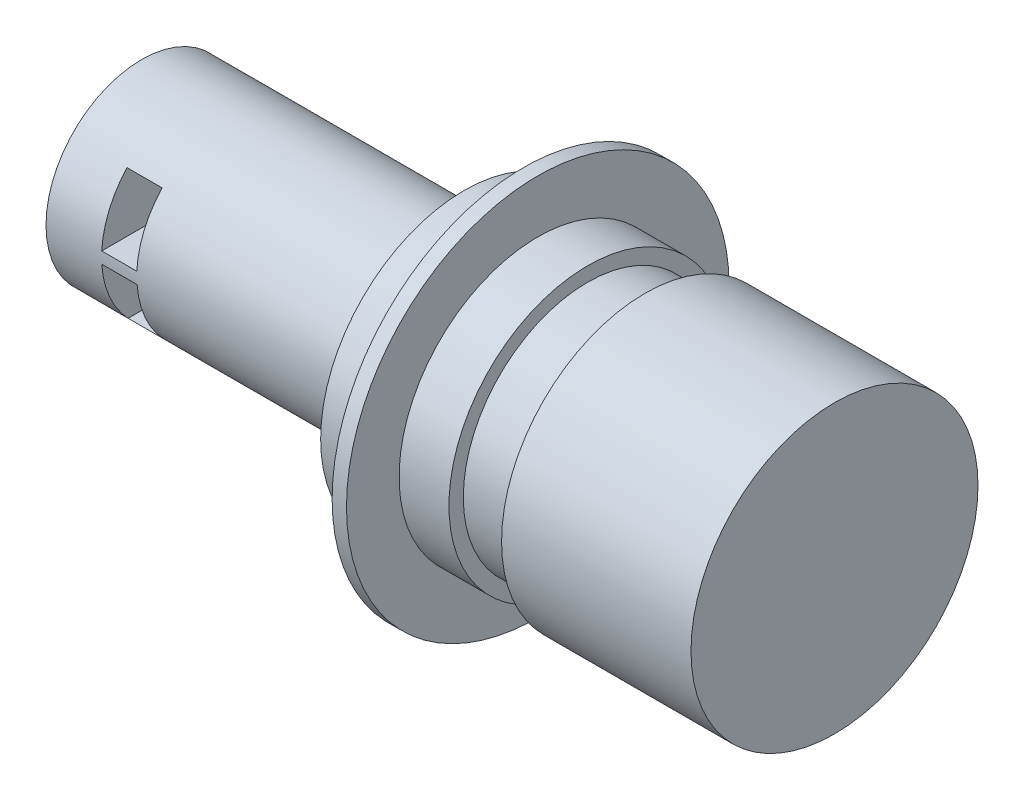
ISO-10303-21;
HEADER;
FILE_DESCRIPTION(('STEP AP214'),'2;1');
FILE_NAME('part.step','',(''),(''),'','','');
FILE_SCHEMA(('AUTOMOTIVE_DESIGN { 1 0 10303 214 1 1 1 1 }'));
ENDSEC;
DATA;
#1=APPLICATION_CONTEXT('core data for automotive mechanical design processes');
#2=APPLICATION_PROTOCOL_DEFINITION('international standard','automotive_design',2000,#1);
#3=PRODUCT_CONTEXT('',#1,'mechanical');
#4=PRODUCT('Part','Part','',(#3));
#5=PRODUCT_RELATED_PRODUCT_CATEGORY('part','',(#4));
#6=PRODUCT_DEFINITION_FORMATION('','',#4);
#7=PRODUCT_DEFINITION_CONTEXT('part definition',#1,'design');
#8=PRODUCT_DEFINITION('design','',#6,#7);
#9=PRODUCT_DEFINITION_SHAPE('','',#8);
#10=(LENGTH_UNIT() NAMED_UNIT(*) SI_UNIT(.MILLI.,.METRE.));
#11=(NAMED_UNIT(*) PLANE_ANGLE_UNIT() SI_UNIT($,.RADIAN.));
#12=(NAMED_UNIT(*) SI_UNIT($,.STERADIAN.) SOLID_ANGLE_UNIT());
#13=UNCERTAINTY_MEASURE_WITH_UNIT(LENGTH_MEASURE(1.E-05),#10,'distance_accuracy_value','');
#14=(GEOMETRIC_REPRESENTATION_CONTEXT(3) GLOBAL_UNCERTAINTY_ASSIGNED_CONTEXT((#13)) GLOBAL_UNIT_ASSIGNED_CONTEXT((#10,
#11,#12)) REPRESENTATION_CONTEXT('',''));
#15=CARTESIAN_POINT('',(0.,0.,0.));
#16=DIRECTION('',(0.,0.,1.));
#17=DIRECTION('',(1.,0.,0.));
#18=AXIS2_PLACEMENT_3D('',#15,#16,#17);
#19=CARTESIAN_POINT('',(-3.50679611650485,30.5473050734273,0.));
#20=DIRECTION('',(1.,0.,0.));
#21=DIRECTION('',(0.,0.,-1.));
#22=AXIS2_PLACEMENT_3D('',#19,#20,#21);
#23=CYLINDRICAL_SURFACE('',#22,10.);
#24=CARTESIAN_POINT('',(2.30239127901001,30.5473050734273,0.));
#25=DIRECTION('',(-1.,0.,0.));
#26=DIRECTION('',(0.,-1.,0.));
#27=AXIS2_PLACEMENT_3D('',#24,#25,#26);
#28=CIRCLE('',#27,10.);
#29=CARTESIAN_POINT('',(2.30239127901001,23.6377288354249,-7.22895263584102));
#30=VERTEX_POINT('',#29);
#31=CARTESIAN_POINT('',(2.30239127901001,29.9138536312668,-9.97991679676864));
#32=VERTEX_POINT('',#31);
#33=EDGE_CURVE('E11',#30,#32,#28,.F.);
#34=ORIENTED_EDGE('',*,*,#33,.F.);
#35=DIRECTION('',(1.,0.,0.));
#36=VECTOR('',#35,1.);
#37=CARTESIAN_POINT('',(-3.50679611650485,23.6377288354249,-7.22895263584102));
#38=LINE('',#37,#36);
#39=CARTESIAN_POINT('',(6.00266542996301,23.6377288354249,-7.22895263584102));
#40=VERTEX_POINT('',#39);
#41=EDGE_CURVE('E79',#40,#30,#38,.F.);
#42=ORIENTED_EDGE('',*,*,#41,.F.);
#43=CARTESIAN_POINT('',(6.00266542996301,30.5473050734273,0.));
#44=DIRECTION('',(-1.,0.,0.));
#45=DIRECTION('',(0.,-1.,0.));
#46=AXIS2_PLACEMENT_3D('',#43,#44,#45);
#47=CIRCLE('',#46,10.);
#48=CARTESIAN_POINT('',(6.00266542996301,29.9138536312668,-9.97991679676865));
#49=VERTEX_POINT('',#48);
#50=EDGE_CURVE('E85',#40,#49,#47,.F.);
#51=ORIENTED_EDGE('',*,*,#50,.T.);
#52=DIRECTION('',(1.,0.,0.));
#53=VECTOR('',#52,1.);
#54=CARTESIAN_POINT('',(-3.50679611650485,29.9138536312668,-9.97991679676864));
#55=LINE('',#54,#53);
#56=EDGE_CURVE('E19',#49,#32,#55,.F.);
#57=ORIENTED_EDGE('',*,*,#56,.T.);
#58=EDGE_LOOP('',(#34,#42,#51,#57));
#59=FACE_BOUND('',#58,.T.);
#60=CARTESIAN_POINT('',(2.30239127901001,29.9138536312668,9.97991679676864));
#61=VERTEX_POINT('',#60);
#62=CARTESIAN_POINT('',(2.30239127901001,23.6377288354249,7.22895263584102));
#63=VERTEX_POINT('',#62);
#64=EDGE_CURVE('E26',#61,#63,#28,.F.);
#65=ORIENTED_EDGE('',*,*,#64,.F.);
#66=DIRECTION('',(1.,0.,0.));
#67=VECTOR('',#66,1.);
#68=CARTESIAN_POINT('',(-3.50679611650485,29.9138536312668,9.97991679676864));
#69=LINE('',#68,#67);
#70=CARTESIAN_POINT('',(6.00266542996301,29.9138536312668,9.97991679676864));
#71=VERTEX_POINT('',#70);
#72=EDGE_CURVE('E109',#61,#71,#69,.T.);
#73=ORIENTED_EDGE('',*,*,#72,.T.);
#74=CARTESIAN_POINT('',(6.00266542996301,23.6377288354249,7.22895263584102));
#75=VERTEX_POINT('',#74);
#76=EDGE_CURVE('E104',#71,#75,#47,.F.);
#77=ORIENTED_EDGE('',*,*,#76,.T.);
#78=DIRECTION('',(1.,0.,0.));
#79=VECTOR('',#78,1.);
#80=CARTESIAN_POINT('',(-3.50679611650485,23.6377288354249,7.22895263584102));
#81=LINE('',#80,#79);
#82=EDGE_CURVE('E110',#63,#75,#81,.T.);
#83=ORIENTED_EDGE('',*,*,#82,.F.);
#84=EDGE_LOOP('',(#65,#73,#77,#83));
#85=FACE_BOUND('',#84,.T.);
#86=CARTESIAN_POINT('',(2.30239127901001,30.5473050734273,0.));
#87=DIRECTION('',(-1.,0.,0.));
#88=DIRECTION('',(0.,0.,1.));
#89=AXIS2_PLACEMENT_3D('',#86,#87,#88);
#90=CIRCLE('',#89,10.);
#91=CARTESIAN_POINT('',(2.30239127901001,31.1139114812485,-9.98393495464669));
#92=VERTEX_POINT('',#91);
#93=CARTESIAN_POINT('',(2.30239127901001,37.3368407984636,-7.3418120813908));
#94=VERTEX_POINT('',#93);
#95=EDGE_CURVE('E114',#92,#94,#90,.F.);
#96=ORIENTED_EDGE('',*,*,#95,.F.);
#97=DIRECTION('',(1.,0.,0.));
#98=VECTOR('',#97,1.);
#99=CARTESIAN_POINT('',(-3.50679611650485,31.1139114812485,-9.98393495464669));
#100=LINE('',#99,#98);
#101=CARTESIAN_POINT('',(5.96455764710562,31.1139114812485,-9.98393495464669));
#102=VERTEX_POINT('',#101);
#103=EDGE_CURVE('E124',#102,#92,#100,.F.);
#104=ORIENTED_EDGE('',*,*,#103,.F.);
#105=CARTESIAN_POINT('',(5.96455764710562,30.5473050734273,0.));
#106=DIRECTION('',(-1.,0.,0.));
#107=DIRECTION('',(0.,0.,1.));
#108=AXIS2_PLACEMENT_3D('',#105,#106,#107);
#109=CIRCLE('',#108,10.);
#110=CARTESIAN_POINT('',(5.96455764710562,37.3368407984636,-7.3418120813908));
#111=VERTEX_POINT('',#110);
#112=EDGE_CURVE('E123',#102,#111,#109,.F.);
#113=ORIENTED_EDGE('',*,*,#112,.T.);
#114=DIRECTION('',(1.,0.,0.));
#115=VECTOR('',#114,1.);
#116=CARTESIAN_POINT('',(-3.50679611650485,37.3368407984636,-7.3418120813908));
#117=LINE('',#116,#115);
#118=EDGE_CURVE('E116',#111,#94,#117,.F.);
#119=ORIENTED_EDGE('',*,*,#118,.T.);
#120=EDGE_LOOP('',(#96,#104,#113,#119));
#121=FACE_BOUND('',#120,.T.);
#122=CARTESIAN_POINT('',(2.30239127901001,37.3368407984636,7.3418120813908));
#123=VERTEX_POINT('',#122);
#124=CARTESIAN_POINT('',(2.30239127901001,31.1139114812485,9.98393495464669));
#125=VERTEX_POINT('',#124);
#126=EDGE_CURVE('E118',#123,#125,#90,.F.);
#127=ORIENTED_EDGE('',*,*,#126,.F.);
#128=DIRECTION('',(1.,0.,0.));
#129=VECTOR('',#128,1.);
#130=CARTESIAN_POINT('',(-3.50679611650485,37.3368407984636,7.3418120813908));
#131=LINE('',#130,#129);
#132=CARTESIAN_POINT('',(5.96455764710562,37.3368407984636,7.3418120813908));
#133=VERTEX_POINT('',#132);
#134=EDGE_CURVE('E129',#123,#133,#131,.T.);
#135=ORIENTED_EDGE('',*,*,#134,.T.);
#136=CARTESIAN_POINT('',(5.96455764710562,31.1139114812485,9.98393495464669));
#137=VERTEX_POINT('',#136);
#138=EDGE_CURVE('E133',#133,#137,#109,.F.);
#139=ORIENTED_EDGE('',*,*,#138,.T.);
#140=DIRECTION('',(1.,0.,0.));
#141=VECTOR('',#140,1.);
#142=CARTESIAN_POINT('',(-3.50679611650485,31.1139114812485,9.98393495464669));
#143=LINE('',#142,#141);
#144=EDGE_CURVE('E137',#125,#137,#143,.T.);
#145=ORIENTED_EDGE('',*,*,#144,.F.);
#146=EDGE_LOOP('',(#127,#135,#139,#145));
#147=FACE_BOUND('',#146,.T.);
#148=CARTESIAN_POINT('',(-3.50679611650485,30.5473050734273,0.));
#149=DIRECTION('',(1.,0.,0.));
#150=DIRECTION('',(0.,0.,-1.));
#151=AXIS2_PLACEMENT_3D('',#148,#149,#150);
#152=CIRCLE('',#151,10.);
#153=CARTESIAN_POINT('',(-3.50679611650485,30.5473050734273,-10.));
#154=VERTEX_POINT('',#153);
#155=EDGE_CURVE('E140',#154,#154,#152,.T.);
#156=ORIENTED_EDGE('',*,*,#155,.T.);
#157=EDGE_LOOP('',(#156));
#158=FACE_BOUND('',#157,.T.);
#159=CARTESIAN_POINT('',(30.2,30.5473050734273,0.));
#160=DIRECTION('',(1.,0.,0.));
#161=DIRECTION('',(0.,0.,-1.));
#162=AXIS2_PLACEMENT_3D('',#159,#160,#161);
#163=CIRCLE('',#162,10.);
#164=CARTESIAN_POINT('',(30.2,30.5473050734273,-10.));
#165=VERTEX_POINT('',#164);
#166=EDGE_CURVE('E144',#165,#165,#163,.T.);
#167=ORIENTED_EDGE('',*,*,#166,.F.);
#168=EDGE_LOOP('',(#167));
#169=FACE_BOUND('',#168,.T.);
#170=ADVANCED_FACE('F16',(#59,#85,#121,#147,#158,#169),#23,.T.);
#171=CARTESIAN_POINT('',(-3.50679611650485,30.5473050734273,0.));
#172=DIRECTION('',(1.,0.,0.));
#173=DIRECTION('',(0.,0.,-1.));
#174=AXIS2_PLACEMENT_3D('',#171,#172,#173);
#175=PLANE('',#174);
#176=ORIENTED_EDGE('',*,*,#155,.F.);
#177=EDGE_LOOP('',(#176));
#178=FACE_BOUND('',#177,.T.);
#179=ADVANCED_FACE('F229',(#178),#175,.F.);
#180=CARTESIAN_POINT('',(36.4,30.5473050734273,0.));
#181=DIRECTION('',(-1.,0.,0.));
#182=DIRECTION('',(0.,0.,1.));
#183=AXIS2_PLACEMENT_3D('',#180,#181,#182);
#184=CYLINDRICAL_SURFACE('',#183,15.);
#185=CARTESIAN_POINT('',(36.4,30.5473050734273,0.));
#186=DIRECTION('',(1.,0.,0.));
#187=DIRECTION('',(0.,0.,-1.));
#188=AXIS2_PLACEMENT_3D('',#185,#186,#187);
#189=CIRCLE('',#188,15.);
#190=CARTESIAN_POINT('',(36.4,30.5473050734273,-15.));
#191=VERTEX_POINT('',#190);
#192=EDGE_CURVE('E148',#191,#191,#189,.T.);
#193=ORIENTED_EDGE('',*,*,#192,.F.);
#194=EDGE_LOOP('',(#193));
#195=FACE_BOUND('',#194,.T.);
#196=CARTESIAN_POINT('',(30.2,30.5473050734273,0.));
#197=DIRECTION('',(1.,0.,0.));
#198=DIRECTION('',(0.,0.,-1.));
#199=AXIS2_PLACEMENT_3D('',#196,#197,#198);
#200=CIRCLE('',#199,15.);
#201=CARTESIAN_POINT('',(30.2,30.5473050734273,-15.));
#202=VERTEX_POINT('',#201);
#203=EDGE_CURVE('E149',#202,#202,#200,.T.);
#204=ORIENTED_EDGE('',*,*,#203,.T.);
#205=EDGE_LOOP('',(#204));
#206=FACE_BOUND('',#205,.T.);
#207=ADVANCED_FACE('F232',(#195,#206),#184,.T.);
#208=CARTESIAN_POINT('',(30.2,30.5473050734273,0.));
#209=DIRECTION('',(1.,0.,0.));
#210=DIRECTION('',(0.,0.,-1.));
#211=AXIS2_PLACEMENT_3D('',#208,#209,#210);
#212=PLANE('',#211);
#213=ORIENTED_EDGE('',*,*,#166,.T.);
#214=EDGE_LOOP('',(#213));
#215=FACE_BOUND('',#214,.T.);
#216=ORIENTED_EDGE('',*,*,#203,.F.);
#217=EDGE_LOOP('',(#216));
#218=FACE_BOUND('',#217,.T.);
#219=ADVANCED_FACE('F236',(#215,#218),#212,.F.);
#220=CARTESIAN_POINT('',(2.30239127901001,37.3368407984636,-11.));
#221=DIRECTION('',(-1.,0.,0.));
#222=DIRECTION('',(0.,0.,1.));
#223=AXIS2_PLACEMENT_3D('',#220,#221,#222);
#224=PLANE('',#223);
#225=ORIENTED_EDGE('',*,*,#95,.T.);
#226=DIRECTION('',(0.,0.,1.));
#227=VECTOR('',#226,1.);
#228=CARTESIAN_POINT('',(2.30239127901001,37.3368407984636,-11.));
#229=LINE('',#228,#227);
#230=EDGE_CURVE('E153',#94,#123,#229,.T.);
#231=ORIENTED_EDGE('',*,*,#230,.T.);
#232=ORIENTED_EDGE('',*,*,#126,.T.);
#233=DIRECTION('',(0.,0.,1.));
#234=VECTOR('',#233,1.);
#235=CARTESIAN_POINT('',(2.30239127901001,31.1139114812485,-11.));
#236=LINE('',#235,#234);
#237=EDGE_CURVE('E157',#92,#125,#236,.T.);
#238=ORIENTED_EDGE('',*,*,#237,.F.);
#239=EDGE_LOOP('',(#225,#231,#232,#238));
#240=FACE_BOUND('',#239,.T.);
#241=ADVANCED_FACE('F243',(#240),#224,.F.);
#242=CARTESIAN_POINT('',(2.30239127901001,37.3368407984636,-11.));
#243=DIRECTION('',(0.,-1.,0.));
#244=DIRECTION('',(0.,0.,-1.));
#245=AXIS2_PLACEMENT_3D('',#242,#243,#244);
#246=PLANE('',#245);
#247=DIRECTION('',(0.,0.,1.));
#248=VECTOR('',#247,1.);
#249=CARTESIAN_POINT('',(5.96455764710562,37.3368407984636,-11.));
#250=LINE('',#249,#248);
#251=EDGE_CURVE('E165',#111,#133,#250,.T.);
#252=ORIENTED_EDGE('',*,*,#251,.T.);
#253=ORIENTED_EDGE('',*,*,#134,.F.);
#254=ORIENTED_EDGE('',*,*,#230,.F.);
#255=ORIENTED_EDGE('',*,*,#118,.F.);
#256=EDGE_LOOP('',(#252,#253,#254,#255));
#257=FACE_BOUND('',#256,.T.);
#258=ADVANCED_FACE('F247',(#257),#246,.T.);
#259=CARTESIAN_POINT('',(5.96455764710562,37.3368407984636,-11.));
#260=DIRECTION('',(-1.,0.,0.));
#261=DIRECTION('',(0.,0.,1.));
#262=AXIS2_PLACEMENT_3D('',#259,#260,#261);
#263=PLANE('',#262);
#264=DIRECTION('',(0.,0.,1.));
#265=VECTOR('',#264,1.);
#266=CARTESIAN_POINT('',(5.96455764710562,31.1139114812485,-11.));
#267=LINE('',#266,#265);
#268=EDGE_CURVE('E160',#102,#137,#267,.T.);
#269=ORIENTED_EDGE('',*,*,#268,.T.);
#270=ORIENTED_EDGE('',*,*,#138,.F.);
#271=ORIENTED_EDGE('',*,*,#251,.F.);
#272=ORIENTED_EDGE('',*,*,#112,.F.);
#273=EDGE_LOOP('',(#269,#270,#271,#272));
#274=FACE_BOUND('',#273,.T.);
#275=ADVANCED_FACE('F252',(#274),#263,.T.);
#276=CARTESIAN_POINT('',(2.30239127901001,31.1139114812485,-11.));
#277=DIRECTION('',(0.,-1.,0.));
#278=DIRECTION('',(0.,0.,-1.));
#279=AXIS2_PLACEMENT_3D('',#276,#277,#278);
#280=PLANE('',#279);
#281=ORIENTED_EDGE('',*,*,#103,.T.);
#282=ORIENTED_EDGE('',*,*,#237,.T.);
#283=ORIENTED_EDGE('',*,*,#144,.T.);
#284=ORIENTED_EDGE('',*,*,#268,.F.);
#285=EDGE_LOOP('',(#281,#282,#283,#284));
#286=FACE_BOUND('',#285,.T.);
#287=ADVANCED_FACE('F249',(#286),#280,.F.);
#288=CARTESIAN_POINT('',(2.30239127901001,29.9138536312668,-10.75));
#289=DIRECTION('',(-1.,0.,0.));
#290=DIRECTION('',(0.,-1.,0.));
#291=AXIS2_PLACEMENT_3D('',#288,#289,#290);
#292=PLANE('',#291);
#293=ORIENTED_EDGE('',*,*,#33,.T.);
#294=DIRECTION('',(0.,0.,1.));
#295=VECTOR('',#294,1.);
#296=CARTESIAN_POINT('',(2.30239127901001,29.9138536312668,-10.75));
#297=LINE('',#296,#295);
#298=EDGE_CURVE('E161',#32,#61,#297,.T.);
#299=ORIENTED_EDGE('',*,*,#298,.T.);
#300=ORIENTED_EDGE('',*,*,#64,.T.);
#301=DIRECTION('',(0.,0.,1.));
#302=VECTOR('',#301,1.);
#303=CARTESIAN_POINT('',(2.30239127901001,23.6377288354249,-10.75));
#304=LINE('',#303,#302);
#305=EDGE_CURVE('E38',#30,#63,#304,.T.);
#306=ORIENTED_EDGE('',*,*,#305,.F.);
#307=EDGE_LOOP('',(#293,#299,#300,#306));
#308=FACE_BOUND('',#307,.T.);
#309=ADVANCED_FACE('F87',(#308),#292,.F.);
#310=CARTESIAN_POINT('',(2.30239127901001,29.9138536312668,-10.75));
#311=DIRECTION('',(0.,-1.,0.));
#312=DIRECTION('',(0.,0.,-1.));
#313=AXIS2_PLACEMENT_3D('',#310,#311,#312);
#314=PLANE('',#313);
#315=DIRECTION('',(0.,0.,1.));
#316=VECTOR('',#315,1.);
#317=CARTESIAN_POINT('',(6.00266542996301,29.9138536312668,-10.75));
#318=LINE('',#317,#316);
#319=EDGE_CURVE('E174',#49,#71,#318,.T.);
#320=ORIENTED_EDGE('',*,*,#319,.T.);
#321=ORIENTED_EDGE('',*,*,#72,.F.);
#322=ORIENTED_EDGE('',*,*,#298,.F.);
#323=ORIENTED_EDGE('',*,*,#56,.F.);
#324=EDGE_LOOP('',(#320,#321,#322,#323));
#325=FACE_BOUND('',#324,.T.);
#326=ADVANCED_FACE('F262',(#325),#314,.T.);
#327=CARTESIAN_POINT('',(6.00266542996301,29.9138536312668,-10.75));
#328=DIRECTION('',(-1.,0.,0.));
#329=DIRECTION('',(0.,-1.,0.));
#330=AXIS2_PLACEMENT_3D('',#327,#328,#329);
#331=PLANE('',#330);
#332=DIRECTION('',(0.,0.,1.));
#333=VECTOR('',#332,1.);
#334=CARTESIAN_POINT('',(6.00266542996301,23.6377288354249,-10.75));
#335=LINE('',#334,#333);
#336=EDGE_CURVE('E33',#40,#75,#335,.T.);
#337=ORIENTED_EDGE('',*,*,#336,.T.);
#338=ORIENTED_EDGE('',*,*,#76,.F.);
#339=ORIENTED_EDGE('',*,*,#319,.F.);
#340=ORIENTED_EDGE('',*,*,#50,.F.);
#341=EDGE_LOOP('',(#337,#338,#339,#340));
#342=FACE_BOUND('',#341,.T.);
#343=ADVANCED_FACE('F266',(#342),#331,.T.);
#344=CARTESIAN_POINT('',(2.30239127901001,23.6377288354249,-10.75));
#345=DIRECTION('',(0.,-1.,0.));
#346=DIRECTION('',(0.,0.,-1.));
#347=AXIS2_PLACEMENT_3D('',#344,#345,#346);
#348=PLANE('',#347);
#349=ORIENTED_EDGE('',*,*,#41,.T.);
#350=ORIENTED_EDGE('',*,*,#305,.T.);
#351=ORIENTED_EDGE('',*,*,#82,.T.);
#352=ORIENTED_EDGE('',*,*,#336,.F.);
#353=EDGE_LOOP('',(#349,#350,#351,#352));
#354=FACE_BOUND('',#353,.T.);
#355=ADVANCED_FACE('F80',(#354),#348,.F.);
#356=CARTESIAN_POINT('',(37.9,30.7247561800637,0.));
#357=DIRECTION('',(-1.,0.,0.));
#358=DIRECTION('',(0.,0.,1.));
#359=AXIS2_PLACEMENT_3D('',#356,#357,#358);
#360=CYLINDRICAL_SURFACE('',#359,20.);
#361=CARTESIAN_POINT('',(37.9,30.7247561800637,0.));
#362=DIRECTION('',(1.,0.,0.));
#363=DIRECTION('',(0.,0.,-1.));
#364=AXIS2_PLACEMENT_3D('',#361,#362,#363);
#365=CIRCLE('',#364,20.);
#366=CARTESIAN_POINT('',(37.9,30.7247561800637,-20.));
#367=VERTEX_POINT('',#366);
#368=EDGE_CURVE('E93',#367,#367,#365,.T.);
#369=ORIENTED_EDGE('',*,*,#368,.F.);
#370=EDGE_LOOP('',(#369));
#371=FACE_BOUND('',#370,.T.);
#372=CARTESIAN_POINT('',(36.4,30.7247561800637,0.));
#373=DIRECTION('',(1.,0.,0.));
#374=DIRECTION('',(0.,0.,-1.));
#375=AXIS2_PLACEMENT_3D('',#372,#373,#374);
#376=CIRCLE('',#375,20.);
#377=CARTESIAN_POINT('',(36.4,30.7247561800637,-20.));
#378=VERTEX_POINT('',#377);
#379=EDGE_CURVE('E179',#378,#378,#376,.T.);
#380=ORIENTED_EDGE('',*,*,#379,.T.);
#381=EDGE_LOOP('',(#380));
#382=FACE_BOUND('',#381,.T.);
#383=ADVANCED_FACE('F265',(#371,#382),#360,.T.);
#384=CARTESIAN_POINT('',(37.9,30.7247561800637,0.));
#385=DIRECTION('',(1.,0.,0.));
#386=DIRECTION('',(0.,0.,-1.));
#387=AXIS2_PLACEMENT_3D('',#384,#385,#386);
#388=PLANE('',#387);
#389=CARTESIAN_POINT('',(37.9,30.6970162606355,0.));
#390=DIRECTION('',(1.,0.,0.));
#391=DIRECTION('',(0.,0.,-1.));
#392=AXIS2_PLACEMENT_3D('',#389,#390,#391);
#393=CIRCLE('',#392,14.5);
#394=CARTESIAN_POINT('',(37.9,30.6970162606355,-14.5));
#395=VERTEX_POINT('',#394);
#396=EDGE_CURVE('E187',#395,#395,#393,.T.);
#397=ORIENTED_EDGE('',*,*,#396,.F.);
#398=EDGE_LOOP('',(#397));
#399=FACE_BOUND('',#398,.T.);
#400=ORIENTED_EDGE('',*,*,#368,.T.);
#401=EDGE_LOOP('',(#400));
#402=FACE_BOUND('',#401,.T.);
#403=ADVANCED_FACE('F274',(#399,#402),#388,.T.);
#404=CARTESIAN_POINT('',(36.4,30.7247561800637,0.));
#405=DIRECTION('',(1.,0.,0.));
#406=DIRECTION('',(0.,0.,-1.));
#407=AXIS2_PLACEMENT_3D('',#404,#405,#406);
#408=PLANE('',#407);
#409=ORIENTED_EDGE('',*,*,#192,.T.);
#410=EDGE_LOOP('',(#409));
#411=FACE_BOUND('',#410,.T.);
#412=ORIENTED_EDGE('',*,*,#379,.F.);
#413=EDGE_LOOP('',(#412));
#414=FACE_BOUND('',#413,.T.);
#415=ADVANCED_FACE('F276',(#411,#414),#408,.F.);
#416=CARTESIAN_POINT('',(43.1110132245822,30.6970162606355,0.));
#417=DIRECTION('',(-1.,0.,0.));
#418=DIRECTION('',(0.,0.,1.));
#419=AXIS2_PLACEMENT_3D('',#416,#417,#418);
#420=CYLINDRICAL_SURFACE('',#419,14.5);
#421=CARTESIAN_POINT('',(43.1110132245822,30.6970162606355,0.));
#422=DIRECTION('',(1.,0.,0.));
#423=DIRECTION('',(0.,0.,-1.));
#424=AXIS2_PLACEMENT_3D('',#421,#422,#423);
#425=CIRCLE('',#424,14.5);
#426=CARTESIAN_POINT('',(43.1110132245822,30.6970162606355,-14.5));
#427=VERTEX_POINT('',#426);
#428=EDGE_CURVE('E183',#427,#427,#425,.T.);
#429=ORIENTED_EDGE('',*,*,#428,.F.);
#430=EDGE_LOOP('',(#429));
#431=FACE_BOUND('',#430,.T.);
#432=ORIENTED_EDGE('',*,*,#396,.T.);
#433=EDGE_LOOP('',(#432));
#434=FACE_BOUND('',#433,.T.);
#435=ADVANCED_FACE('F279',(#431,#434),#420,.T.);
#436=CARTESIAN_POINT('',(43.1110132245822,30.6970162606355,0.));
#437=DIRECTION('',(1.,0.,0.));
#438=DIRECTION('',(0.,0.,-1.));
#439=AXIS2_PLACEMENT_3D('',#436,#437,#438);
#440=PLANE('',#439);
#441=CARTESIAN_POINT('',(43.1110132245822,30.6970162606355,0.));
#442=DIRECTION('',(1.,0.,0.));
#443=DIRECTION('',(0.,0.,-1.));
#444=AXIS2_PLACEMENT_3D('',#441,#442,#443);
#445=CIRCLE('',#444,13.);
#446=CARTESIAN_POINT('',(43.1110132245822,30.6970162606355,-13.));
#447=VERTEX_POINT('',#446);
#448=EDGE_CURVE('E195',#447,#447,#445,.T.);
#449=ORIENTED_EDGE('',*,*,#448,.F.);
#450=EDGE_LOOP('',(#449));
#451=FACE_BOUND('',#450,.T.);
#452=ORIENTED_EDGE('',*,*,#428,.T.);
#453=EDGE_LOOP('',(#452));
#454=FACE_BOUND('',#453,.T.);
#455=ADVANCED_FACE('F286',(#451,#454),#440,.T.);
#456=CARTESIAN_POINT('',(49.1110132245822,30.6970162606355,0.));
#457=DIRECTION('',(-1.,0.,0.));
#458=DIRECTION('',(0.,0.,1.));
#459=AXIS2_PLACEMENT_3D('',#456,#457,#458);
#460=CYLINDRICAL_SURFACE('',#459,13.);
#461=CARTESIAN_POINT('',(49.1110132245822,30.6970162606355,0.));
#462=DIRECTION('',(1.,0.,0.));
#463=DIRECTION('',(0.,0.,-1.));
#464=AXIS2_PLACEMENT_3D('',#461,#462,#463);
#465=CIRCLE('',#464,13.);
#466=CARTESIAN_POINT('',(49.1110132245822,30.6970162606355,-13.));
#467=VERTEX_POINT('',#466);
#468=EDGE_CURVE('E191',#467,#467,#465,.T.);
#469=ORIENTED_EDGE('',*,*,#468,.F.);
#470=EDGE_LOOP('',(#469));
#471=FACE_BOUND('',#470,.T.);
#472=ORIENTED_EDGE('',*,*,#448,.T.);
#473=EDGE_LOOP('',(#472));
#474=FACE_BOUND('',#473,.T.);
#475=ADVANCED_FACE('F216',(#471,#474),#460,.T.);
#476=CARTESIAN_POINT('',(68.9110132245822,30.6970162606355,0.));
#477=DIRECTION('',(-1.,0.,0.));
#478=DIRECTION('',(0.,0.,1.));
#479=AXIS2_PLACEMENT_3D('',#476,#477,#478);
#480=CYLINDRICAL_SURFACE('',#479,15.);
#481=CARTESIAN_POINT('',(68.9110132245822,30.6970162606355,0.));
#482=DIRECTION('',(1.,0.,0.));
#483=DIRECTION('',(0.,0.,-1.));
#484=AXIS2_PLACEMENT_3D('',#481,#482,#483);
#485=CIRCLE('',#484,15.);
#486=CARTESIAN_POINT('',(68.9110132245822,30.6970162606355,-15.));
#487=VERTEX_POINT('',#486);
#488=EDGE_CURVE('E199',#487,#487,#485,.T.);
#489=ORIENTED_EDGE('',*,*,#488,.F.);
#490=EDGE_LOOP('',(#489));
#491=FACE_BOUND('',#490,.T.);
#492=CARTESIAN_POINT('',(49.1110132245822,30.6970162606355,0.));
#493=DIRECTION('',(1.,0.,0.));
#494=DIRECTION('',(0.,0.,-1.));
#495=AXIS2_PLACEMENT_3D('',#492,#493,#494);
#496=CIRCLE('',#495,15.);
#497=CARTESIAN_POINT('',(49.1110132245822,30.6970162606355,-15.));
#498=VERTEX_POINT('',#497);
#499=EDGE_CURVE('E203',#498,#498,#496,.T.);
#500=ORIENTED_EDGE('',*,*,#499,.T.);
#501=EDGE_LOOP('',(#500));
#502=FACE_BOUND('',#501,.T.);
#503=ADVANCED_FACE('F213',(#491,#502),#480,.T.);
#504=CARTESIAN_POINT('',(68.9110132245822,30.6970162606355,0.));
#505=DIRECTION('',(1.,0.,0.));
#506=DIRECTION('',(0.,0.,-1.));
#507=AXIS2_PLACEMENT_3D('',#504,#505,#506);
#508=PLANE('',#507);
#509=ORIENTED_EDGE('',*,*,#488,.T.);
#510=EDGE_LOOP('',(#509));
#511=FACE_BOUND('',#510,.T.);
#512=ADVANCED_FACE('F211',(#511),#508,.T.);
#513=CARTESIAN_POINT('',(49.1110132245822,30.6970162606355,0.));
#514=DIRECTION('',(1.,0.,0.));
#515=DIRECTION('',(0.,0.,-1.));
#516=AXIS2_PLACEMENT_3D('',#513,#514,#515);
#517=PLANE('',#516);
#518=ORIENTED_EDGE('',*,*,#468,.T.);
#519=EDGE_LOOP('',(#518));
#520=FACE_BOUND('',#519,.T.);
#521=ORIENTED_EDGE('',*,*,#499,.F.);
#522=EDGE_LOOP('',(#521));
#523=FACE_BOUND('',#522,.T.);
#524=ADVANCED_FACE('F220',(#520,#523),#517,.F.);
#525=CLOSED_SHELL('',(#170,#179,#207,#219,#241,#258,#275,#287,#309,#326,#343,#355,#383,#403,
#415,#435,#455,#475,#503,#512,#524));
#526=MANIFOLD_SOLID_BREP('B1',#525);
#527=ADVANCED_BREP_SHAPE_REPRESENTATION('',(#18,#526),#14);
#528=SHAPE_DEFINITION_REPRESENTATION(#9,#527);
ENDSEC;
END-ISO-10303-21;
